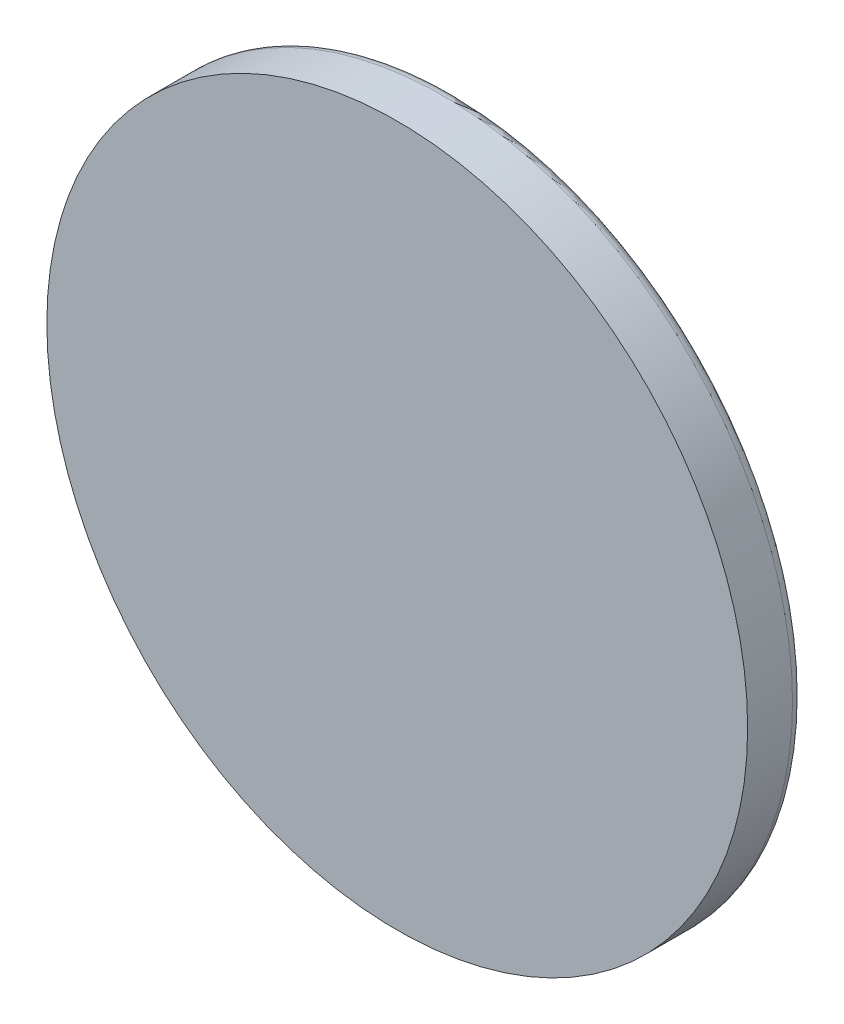
ISO-10303-21;
HEADER;
FILE_DESCRIPTION(('STEP AP214'),'2;1');
FILE_NAME('part.step','',(''),(''),'','','');
FILE_SCHEMA(('AUTOMOTIVE_DESIGN { 1 0 10303 214 1 1 1 1 }'));
ENDSEC;
DATA;
#1=APPLICATION_CONTEXT('core data for automotive mechanical design processes');
#2=APPLICATION_PROTOCOL_DEFINITION('international standard','automotive_design',2000,#1);
#3=PRODUCT_CONTEXT('',#1,'mechanical');
#4=PRODUCT('Part','Part','',(#3));
#5=PRODUCT_RELATED_PRODUCT_CATEGORY('part','',(#4));
#6=PRODUCT_DEFINITION_FORMATION('','',#4);
#7=PRODUCT_DEFINITION_CONTEXT('part definition',#1,'design');
#8=PRODUCT_DEFINITION('design','',#6,#7);
#9=PRODUCT_DEFINITION_SHAPE('','',#8);
#10=(LENGTH_UNIT() NAMED_UNIT(*) SI_UNIT(.MILLI.,.METRE.));
#11=(NAMED_UNIT(*) PLANE_ANGLE_UNIT() SI_UNIT($,.RADIAN.));
#12=(NAMED_UNIT(*) SI_UNIT($,.STERADIAN.) SOLID_ANGLE_UNIT());
#13=UNCERTAINTY_MEASURE_WITH_UNIT(LENGTH_MEASURE(1.E-05),#10,'distance_accuracy_value','');
#14=(GEOMETRIC_REPRESENTATION_CONTEXT(3) GLOBAL_UNCERTAINTY_ASSIGNED_CONTEXT((#13)) GLOBAL_UNIT_ASSIGNED_CONTEXT((#10,
#11,#12)) REPRESENTATION_CONTEXT('',''));
#15=CARTESIAN_POINT('',(0.,0.,0.));
#16=DIRECTION('',(0.,0.,1.));
#17=DIRECTION('',(1.,0.,0.));
#18=AXIS2_PLACEMENT_3D('',#15,#16,#17);
#19=CARTESIAN_POINT('',(0.,0.,0.));
#20=DIRECTION('',(0.,0.,1.));
#21=DIRECTION('',(1.,0.,0.));
#22=AXIS2_PLACEMENT_3D('',#19,#20,#21);
#23=PLANE('',#22);
#24=CARTESIAN_POINT('',(0.,0.,0.));
#25=DIRECTION('',(0.,0.,1.));
#26=DIRECTION('',(1.,0.,0.));
#27=AXIS2_PLACEMENT_3D('',#24,#25,#26);
#28=CIRCLE('',#27,6.05);
#29=CARTESIAN_POINT('',(6.05,0.,0.));
#30=VERTEX_POINT('',#29);
#31=EDGE_CURVE('E26',#30,#30,#28,.T.);
#32=ORIENTED_EDGE('',*,*,#31,.F.);
#33=EDGE_LOOP('',(#32));
#34=FACE_BOUND('',#33,.T.);
#35=ADVANCED_FACE('F15',(#34),#23,.F.);
#36=CARTESIAN_POINT('',(0.,0.,0.2));
#37=DIRECTION('',(0.,0.,-1.));
#38=DIRECTION('',(1.,0.,0.));
#39=AXIS2_PLACEMENT_3D('',#36,#37,#38);
#40=TOROIDAL_SURFACE('',#39,6.05,0.2);
#41=CARTESIAN_POINT('',(0.,0.,0.2));
#42=DIRECTION('',(0.,0.,1.));
#43=DIRECTION('',(1.,0.,0.));
#44=AXIS2_PLACEMENT_3D('',#41,#42,#43);
#45=CIRCLE('',#44,6.25);
#46=CARTESIAN_POINT('',(6.25,0.,0.2));
#47=VERTEX_POINT('',#46);
#48=EDGE_CURVE('E22',#47,#47,#45,.T.);
#49=ORIENTED_EDGE('',*,*,#48,.F.);
#50=EDGE_LOOP('',(#49));
#51=FACE_BOUND('',#50,.T.);
#52=ORIENTED_EDGE('',*,*,#31,.T.);
#53=EDGE_LOOP('',(#52));
#54=FACE_BOUND('',#53,.T.);
#55=ADVANCED_FACE('F36',(#51,#54),#40,.T.);
#56=CARTESIAN_POINT('',(0.,0.,0.));
#57=DIRECTION('',(0.,0.,1.));
#58=DIRECTION('',(1.,0.,0.));
#59=AXIS2_PLACEMENT_3D('',#56,#57,#58);
#60=CYLINDRICAL_SURFACE('',#59,6.25);
#61=CARTESIAN_POINT('',(0.,0.,1.));
#62=DIRECTION('',(0.,0.,1.));
#63=DIRECTION('',(1.,0.,0.));
#64=AXIS2_PLACEMENT_3D('',#61,#62,#63);
#65=CIRCLE('',#64,6.25);
#66=CARTESIAN_POINT('',(6.25,0.,1.));
#67=VERTEX_POINT('',#66);
#68=EDGE_CURVE('E10',#67,#67,#65,.T.);
#69=ORIENTED_EDGE('',*,*,#68,.F.);
#70=EDGE_LOOP('',(#69));
#71=FACE_BOUND('',#70,.T.);
#72=ORIENTED_EDGE('',*,*,#48,.T.);
#73=EDGE_LOOP('',(#72));
#74=FACE_BOUND('',#73,.T.);
#75=ADVANCED_FACE('F40',(#71,#74),#60,.T.);
#76=CARTESIAN_POINT('',(0.,0.,1.));
#77=DIRECTION('',(0.,0.,1.));
#78=DIRECTION('',(1.,0.,0.));
#79=AXIS2_PLACEMENT_3D('',#76,#77,#78);
#80=PLANE('',#79);
#81=ORIENTED_EDGE('',*,*,#68,.T.);
#82=EDGE_LOOP('',(#81));
#83=FACE_BOUND('',#82,.T.);
#84=ADVANCED_FACE('F64',(#83),#80,.T.);
#85=CLOSED_SHELL('',(#35,#55,#75,#84));
#86=MANIFOLD_SOLID_BREP('B1',#85);
#87=ADVANCED_BREP_SHAPE_REPRESENTATION('',(#18,#86),#14);
#88=SHAPE_DEFINITION_REPRESENTATION(#9,#87);
ENDSEC;
END-ISO-10303-21;
